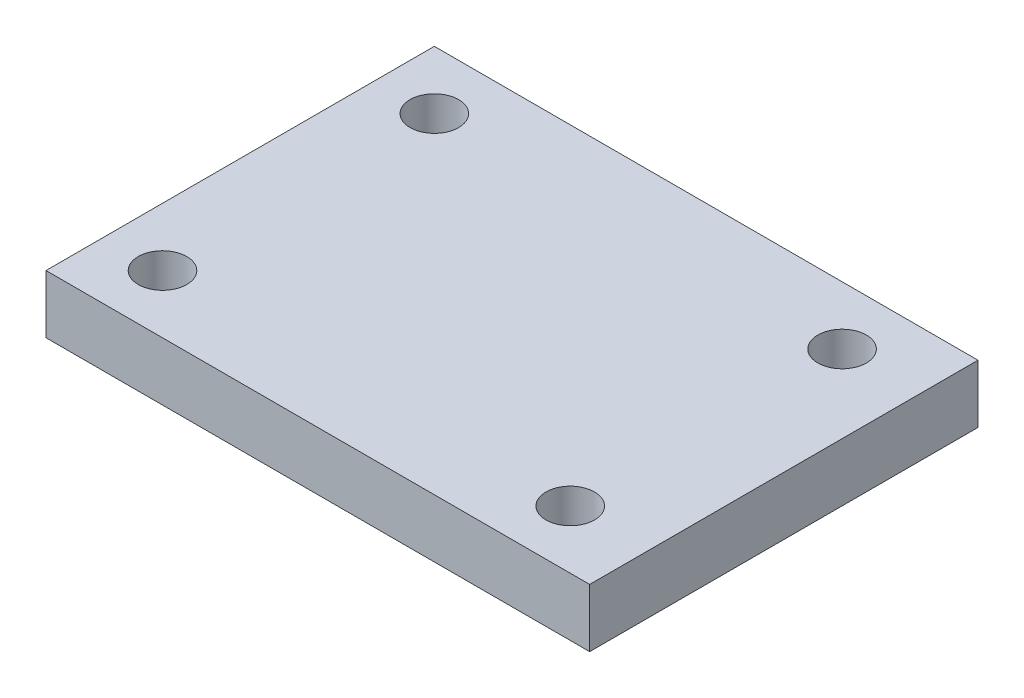
ISO-10303-21;
HEADER;
FILE_DESCRIPTION(('STEP AP214'),'2;1');
FILE_NAME('part.step','',(''),(''),'','','');
FILE_SCHEMA(('AUTOMOTIVE_DESIGN { 1 0 10303 214 1 1 1 1 }'));
ENDSEC;
DATA;
#1=APPLICATION_CONTEXT('core data for automotive mechanical design processes');
#2=APPLICATION_PROTOCOL_DEFINITION('international standard','automotive_design',2000,#1);
#3=PRODUCT_CONTEXT('',#1,'mechanical');
#4=PRODUCT('Part','Part','',(#3));
#5=PRODUCT_RELATED_PRODUCT_CATEGORY('part','',(#4));
#6=PRODUCT_DEFINITION_FORMATION('','',#4);
#7=PRODUCT_DEFINITION_CONTEXT('part definition',#1,'design');
#8=PRODUCT_DEFINITION('design','',#6,#7);
#9=PRODUCT_DEFINITION_SHAPE('','',#8);
#10=(LENGTH_UNIT() NAMED_UNIT(*) SI_UNIT(.MILLI.,.METRE.));
#11=(NAMED_UNIT(*) PLANE_ANGLE_UNIT() SI_UNIT($,.RADIAN.));
#12=(NAMED_UNIT(*) SI_UNIT($,.STERADIAN.) SOLID_ANGLE_UNIT());
#13=UNCERTAINTY_MEASURE_WITH_UNIT(LENGTH_MEASURE(1.E-05),#10,'distance_accuracy_value','');
#14=(GEOMETRIC_REPRESENTATION_CONTEXT(3) GLOBAL_UNCERTAINTY_ASSIGNED_CONTEXT((#13)) GLOBAL_UNIT_ASSIGNED_CONTEXT((#10,
#11,#12)) REPRESENTATION_CONTEXT('',''));
#15=CARTESIAN_POINT('',(0.,0.,0.));
#16=DIRECTION('',(0.,0.,1.));
#17=DIRECTION('',(1.,0.,0.));
#18=AXIS2_PLACEMENT_3D('',#15,#16,#17);
#19=CARTESIAN_POINT('',(-14.,3.,10.));
#20=DIRECTION('',(1.,0.,0.));
#21=DIRECTION('',(0.,0.,-1.));
#22=AXIS2_PLACEMENT_3D('',#19,#20,#21);
#23=PLANE('',#22);
#24=DIRECTION('',(0.,0.,1.));
#25=VECTOR('',#24,1.);
#26=CARTESIAN_POINT('',(-14.,0.,10.));
#27=LINE('',#26,#25);
#28=CARTESIAN_POINT('',(-14.,0.,-10.));
#29=VERTEX_POINT('',#28);
#30=CARTESIAN_POINT('',(-14.,0.,10.));
#31=VERTEX_POINT('',#30);
#32=EDGE_CURVE('E111',#29,#31,#27,.T.);
#33=ORIENTED_EDGE('',*,*,#32,.T.);
#34=DIRECTION('',(0.,-1.,0.));
#35=VECTOR('',#34,1.);
#36=CARTESIAN_POINT('',(-14.,3.,10.));
#37=LINE('',#36,#35);
#38=CARTESIAN_POINT('',(-14.,3.,10.));
#39=VERTEX_POINT('',#38);
#40=EDGE_CURVE('E11',#39,#31,#37,.T.);
#41=ORIENTED_EDGE('',*,*,#40,.F.);
#42=DIRECTION('',(0.,0.,1.));
#43=VECTOR('',#42,1.);
#44=CARTESIAN_POINT('',(-14.,3.,10.));
#45=LINE('',#44,#43);
#46=CARTESIAN_POINT('',(-14.,3.,-10.));
#47=VERTEX_POINT('',#46);
#48=EDGE_CURVE('E95',#47,#39,#45,.T.);
#49=ORIENTED_EDGE('',*,*,#48,.F.);
#50=DIRECTION('',(0.,-1.,0.));
#51=VECTOR('',#50,1.);
#52=CARTESIAN_POINT('',(-14.,3.,-10.));
#53=LINE('',#52,#51);
#54=EDGE_CURVE('E107',#47,#29,#53,.T.);
#55=ORIENTED_EDGE('',*,*,#54,.T.);
#56=EDGE_LOOP('',(#33,#41,#49,#55));
#57=FACE_BOUND('',#56,.T.);
#58=ADVANCED_FACE('F43',(#57),#23,.F.);
#59=CARTESIAN_POINT('',(14.,3.,10.));
#60=DIRECTION('',(0.,0.,-1.));
#61=DIRECTION('',(-1.,0.,0.));
#62=AXIS2_PLACEMENT_3D('',#59,#60,#61);
#63=PLANE('',#62);
#64=DIRECTION('',(1.,0.,0.));
#65=VECTOR('',#64,1.);
#66=CARTESIAN_POINT('',(14.,0.,10.));
#67=LINE('',#66,#65);
#68=CARTESIAN_POINT('',(14.,0.,10.));
#69=VERTEX_POINT('',#68);
#70=EDGE_CURVE('E100',#31,#69,#67,.T.);
#71=ORIENTED_EDGE('',*,*,#70,.T.);
#72=DIRECTION('',(0.,-1.,0.));
#73=VECTOR('',#72,1.);
#74=CARTESIAN_POINT('',(14.,3.,10.));
#75=LINE('',#74,#73);
#76=CARTESIAN_POINT('',(14.,3.,10.));
#77=VERTEX_POINT('',#76);
#78=EDGE_CURVE('E52',#77,#69,#75,.T.);
#79=ORIENTED_EDGE('',*,*,#78,.F.);
#80=DIRECTION('',(1.,0.,0.));
#81=VECTOR('',#80,1.);
#82=CARTESIAN_POINT('',(14.,3.,10.));
#83=LINE('',#82,#81);
#84=EDGE_CURVE('E90',#39,#77,#83,.T.);
#85=ORIENTED_EDGE('',*,*,#84,.F.);
#86=ORIENTED_EDGE('',*,*,#40,.T.);
#87=EDGE_LOOP('',(#71,#79,#85,#86));
#88=FACE_BOUND('',#87,.T.);
#89=ADVANCED_FACE('F99',(#88),#63,.F.);
#90=CARTESIAN_POINT('',(14.,3.,10.));
#91=DIRECTION('',(-1.,0.,0.));
#92=DIRECTION('',(0.,0.,1.));
#93=AXIS2_PLACEMENT_3D('',#90,#91,#92);
#94=PLANE('',#93);
#95=DIRECTION('',(0.,0.,-1.));
#96=VECTOR('',#95,1.);
#97=CARTESIAN_POINT('',(14.,0.,10.));
#98=LINE('',#97,#96);
#99=CARTESIAN_POINT('',(14.,0.,-10.));
#100=VERTEX_POINT('',#99);
#101=EDGE_CURVE('E77',#69,#100,#98,.T.);
#102=ORIENTED_EDGE('',*,*,#101,.T.);
#103=DIRECTION('',(0.,-1.,0.));
#104=VECTOR('',#103,1.);
#105=CARTESIAN_POINT('',(14.,3.,-10.));
#106=LINE('',#105,#104);
#107=CARTESIAN_POINT('',(14.,3.,-10.));
#108=VERTEX_POINT('',#107);
#109=EDGE_CURVE('E102',#108,#100,#106,.T.);
#110=ORIENTED_EDGE('',*,*,#109,.F.);
#111=DIRECTION('',(0.,0.,-1.));
#112=VECTOR('',#111,1.);
#113=CARTESIAN_POINT('',(14.,3.,10.));
#114=LINE('',#113,#112);
#115=EDGE_CURVE('E93',#77,#108,#114,.T.);
#116=ORIENTED_EDGE('',*,*,#115,.F.);
#117=ORIENTED_EDGE('',*,*,#78,.T.);
#118=EDGE_LOOP('',(#102,#110,#116,#117));
#119=FACE_BOUND('',#118,.T.);
#120=ADVANCED_FACE('F103',(#119),#94,.F.);
#121=CARTESIAN_POINT('',(14.,3.,-10.));
#122=DIRECTION('',(0.,0.,1.));
#123=DIRECTION('',(1.,0.,0.));
#124=AXIS2_PLACEMENT_3D('',#121,#122,#123);
#125=PLANE('',#124);
#126=DIRECTION('',(-1.,0.,0.));
#127=VECTOR('',#126,1.);
#128=CARTESIAN_POINT('',(14.,0.,-10.));
#129=LINE('',#128,#127);
#130=EDGE_CURVE('E83',#100,#29,#129,.T.);
#131=ORIENTED_EDGE('',*,*,#130,.T.);
#132=ORIENTED_EDGE('',*,*,#54,.F.);
#133=DIRECTION('',(-1.,0.,0.));
#134=VECTOR('',#133,1.);
#135=CARTESIAN_POINT('',(14.,3.,-10.));
#136=LINE('',#135,#134);
#137=EDGE_CURVE('E60',#108,#47,#136,.T.);
#138=ORIENTED_EDGE('',*,*,#137,.F.);
#139=ORIENTED_EDGE('',*,*,#109,.T.);
#140=EDGE_LOOP('',(#131,#132,#138,#139));
#141=FACE_BOUND('',#140,.T.);
#142=ADVANCED_FACE('F125',(#141),#125,.F.);
#143=CARTESIAN_POINT('',(0.,3.,0.));
#144=DIRECTION('',(0.,1.,0.));
#145=DIRECTION('',(0.,0.,1.));
#146=AXIS2_PLACEMENT_3D('',#143,#144,#145);
#147=PLANE('',#146);
#148=CARTESIAN_POINT('',(-11.,3.,-7.));
#149=DIRECTION('',(0.,1.,0.));
#150=DIRECTION('',(0.,0.,1.));
#151=AXIS2_PLACEMENT_3D('',#148,#149,#150);
#152=CIRCLE('',#151,1.24999999999999);
#153=CARTESIAN_POINT('',(-11.,3.,-5.75000000000001));
#154=VERTEX_POINT('',#153);
#155=EDGE_CURVE('E159',#154,#154,#152,.T.);
#156=ORIENTED_EDGE('',*,*,#155,.F.);
#157=EDGE_LOOP('',(#156));
#158=FACE_BOUND('',#157,.T.);
#159=CARTESIAN_POINT('',(10.,3.,-7.));
#160=DIRECTION('',(0.,1.,0.));
#161=DIRECTION('',(0.,0.,1.));
#162=AXIS2_PLACEMENT_3D('',#159,#160,#161);
#163=CIRCLE('',#162,1.24999999999999);
#164=CARTESIAN_POINT('',(10.,3.,-5.75000000000001));
#165=VERTEX_POINT('',#164);
#166=EDGE_CURVE('E151',#165,#165,#163,.T.);
#167=ORIENTED_EDGE('',*,*,#166,.F.);
#168=EDGE_LOOP('',(#167));
#169=FACE_BOUND('',#168,.T.);
#170=CARTESIAN_POINT('',(10.,3.,7.));
#171=DIRECTION('',(0.,1.,0.));
#172=DIRECTION('',(0.,0.,1.));
#173=AXIS2_PLACEMENT_3D('',#170,#171,#172);
#174=CIRCLE('',#173,1.24999999999999);
#175=CARTESIAN_POINT('',(10.,3.,8.24999999999999));
#176=VERTEX_POINT('',#175);
#177=EDGE_CURVE('E143',#176,#176,#174,.T.);
#178=ORIENTED_EDGE('',*,*,#177,.F.);
#179=EDGE_LOOP('',(#178));
#180=FACE_BOUND('',#179,.T.);
#181=CARTESIAN_POINT('',(-11.,3.,7.));
#182=DIRECTION('',(0.,1.,0.));
#183=DIRECTION('',(0.,0.,1.));
#184=AXIS2_PLACEMENT_3D('',#181,#182,#183);
#185=CIRCLE('',#184,1.24999999999999);
#186=CARTESIAN_POINT('',(-11.,3.,8.24999999999999));
#187=VERTEX_POINT('',#186);
#188=EDGE_CURVE('E135',#187,#187,#185,.T.);
#189=ORIENTED_EDGE('',*,*,#188,.F.);
#190=EDGE_LOOP('',(#189));
#191=FACE_BOUND('',#190,.T.);
#192=ORIENTED_EDGE('',*,*,#48,.T.);
#193=ORIENTED_EDGE('',*,*,#84,.T.);
#194=ORIENTED_EDGE('',*,*,#115,.T.);
#195=ORIENTED_EDGE('',*,*,#137,.T.);
#196=EDGE_LOOP('',(#192,#193,#194,#195));
#197=FACE_BOUND('',#196,.T.);
#198=ADVANCED_FACE('F91',(#158,#169,#180,#191,#197),#147,.T.);
#199=CARTESIAN_POINT('',(0.,0.,0.));
#200=DIRECTION('',(0.,1.,0.));
#201=DIRECTION('',(0.,0.,1.));
#202=AXIS2_PLACEMENT_3D('',#199,#200,#201);
#203=PLANE('',#202);
#204=CARTESIAN_POINT('',(-11.,0.,-7.));
#205=DIRECTION('',(0.,1.,0.));
#206=DIRECTION('',(0.,0.,1.));
#207=AXIS2_PLACEMENT_3D('',#204,#205,#206);
#208=CIRCLE('',#207,1.25);
#209=CARTESIAN_POINT('',(-11.,0.,-5.75));
#210=VERTEX_POINT('',#209);
#211=EDGE_CURVE('E155',#210,#210,#208,.T.);
#212=ORIENTED_EDGE('',*,*,#211,.T.);
#213=EDGE_LOOP('',(#212));
#214=FACE_BOUND('',#213,.T.);
#215=CARTESIAN_POINT('',(10.,0.,-7.));
#216=DIRECTION('',(0.,1.,0.));
#217=DIRECTION('',(0.,0.,1.));
#218=AXIS2_PLACEMENT_3D('',#215,#216,#217);
#219=CIRCLE('',#218,1.25);
#220=CARTESIAN_POINT('',(10.,0.,-5.75));
#221=VERTEX_POINT('',#220);
#222=EDGE_CURVE('E147',#221,#221,#219,.T.);
#223=ORIENTED_EDGE('',*,*,#222,.T.);
#224=EDGE_LOOP('',(#223));
#225=FACE_BOUND('',#224,.T.);
#226=CARTESIAN_POINT('',(10.,0.,7.));
#227=DIRECTION('',(0.,1.,0.));
#228=DIRECTION('',(0.,0.,1.));
#229=AXIS2_PLACEMENT_3D('',#226,#227,#228);
#230=CIRCLE('',#229,1.25);
#231=CARTESIAN_POINT('',(10.,0.,8.25));
#232=VERTEX_POINT('',#231);
#233=EDGE_CURVE('E139',#232,#232,#230,.T.);
#234=ORIENTED_EDGE('',*,*,#233,.T.);
#235=EDGE_LOOP('',(#234));
#236=FACE_BOUND('',#235,.T.);
#237=CARTESIAN_POINT('',(-11.,0.,7.));
#238=DIRECTION('',(0.,1.,0.));
#239=DIRECTION('',(0.,0.,1.));
#240=AXIS2_PLACEMENT_3D('',#237,#238,#239);
#241=CIRCLE('',#240,1.25);
#242=CARTESIAN_POINT('',(-11.,0.,8.25));
#243=VERTEX_POINT('',#242);
#244=EDGE_CURVE('E115',#243,#243,#241,.T.);
#245=ORIENTED_EDGE('',*,*,#244,.T.);
#246=EDGE_LOOP('',(#245));
#247=FACE_BOUND('',#246,.T.);
#248=ORIENTED_EDGE('',*,*,#32,.F.);
#249=ORIENTED_EDGE('',*,*,#130,.F.);
#250=ORIENTED_EDGE('',*,*,#101,.F.);
#251=ORIENTED_EDGE('',*,*,#70,.F.);
#252=EDGE_LOOP('',(#248,#249,#250,#251));
#253=FACE_BOUND('',#252,.T.);
#254=ADVANCED_FACE('F128',(#214,#225,#236,#247,#253),#203,.F.);
#255=CARTESIAN_POINT('',(-11.,3.,7.));
#256=DIRECTION('',(0.,1.,0.));
#257=DIRECTION('',(0.,0.,1.));
#258=AXIS2_PLACEMENT_3D('',#255,#256,#257);
#259=CYLINDRICAL_SURFACE('',#258,1.24999999999999);
#260=ORIENTED_EDGE('',*,*,#244,.F.);
#261=EDGE_LOOP('',(#260));
#262=FACE_BOUND('',#261,.T.);
#263=ORIENTED_EDGE('',*,*,#188,.T.);
#264=EDGE_LOOP('',(#263));
#265=FACE_BOUND('',#264,.T.);
#266=ADVANCED_FACE('F175',(#262,#265),#259,.F.);
#267=CARTESIAN_POINT('',(10.,3.,7.));
#268=DIRECTION('',(0.,1.,0.));
#269=DIRECTION('',(0.,0.,1.));
#270=AXIS2_PLACEMENT_3D('',#267,#268,#269);
#271=CYLINDRICAL_SURFACE('',#270,1.24999999999999);
#272=ORIENTED_EDGE('',*,*,#233,.F.);
#273=EDGE_LOOP('',(#272));
#274=FACE_BOUND('',#273,.T.);
#275=ORIENTED_EDGE('',*,*,#177,.T.);
#276=EDGE_LOOP('',(#275));
#277=FACE_BOUND('',#276,.T.);
#278=ADVANCED_FACE('F177',(#274,#277),#271,.F.);
#279=CARTESIAN_POINT('',(10.,3.,-7.));
#280=DIRECTION('',(0.,1.,0.));
#281=DIRECTION('',(0.,0.,1.));
#282=AXIS2_PLACEMENT_3D('',#279,#280,#281);
#283=CYLINDRICAL_SURFACE('',#282,1.24999999999999);
#284=ORIENTED_EDGE('',*,*,#222,.F.);
#285=EDGE_LOOP('',(#284));
#286=FACE_BOUND('',#285,.T.);
#287=ORIENTED_EDGE('',*,*,#166,.T.);
#288=EDGE_LOOP('',(#287));
#289=FACE_BOUND('',#288,.T.);
#290=ADVANCED_FACE('F184',(#286,#289),#283,.F.);
#291=CARTESIAN_POINT('',(-11.,3.,-7.));
#292=DIRECTION('',(0.,1.,0.));
#293=DIRECTION('',(0.,0.,1.));
#294=AXIS2_PLACEMENT_3D('',#291,#292,#293);
#295=CYLINDRICAL_SURFACE('',#294,1.24999999999999);
#296=ORIENTED_EDGE('',*,*,#211,.F.);
#297=EDGE_LOOP('',(#296));
#298=FACE_BOUND('',#297,.T.);
#299=ORIENTED_EDGE('',*,*,#155,.T.);
#300=EDGE_LOOP('',(#299));
#301=FACE_BOUND('',#300,.T.);
#302=ADVANCED_FACE('F164',(#298,#301),#295,.F.);
#303=CLOSED_SHELL('',(#58,#89,#120,#142,#198,#254,#266,#278,#290,#302));
#304=MANIFOLD_SOLID_BREP('B2',#303);
#305=ADVANCED_BREP_SHAPE_REPRESENTATION('',(#18,#304),#14);
#306=SHAPE_DEFINITION_REPRESENTATION(#9,#305);
ENDSEC;
END-ISO-10303-21;
